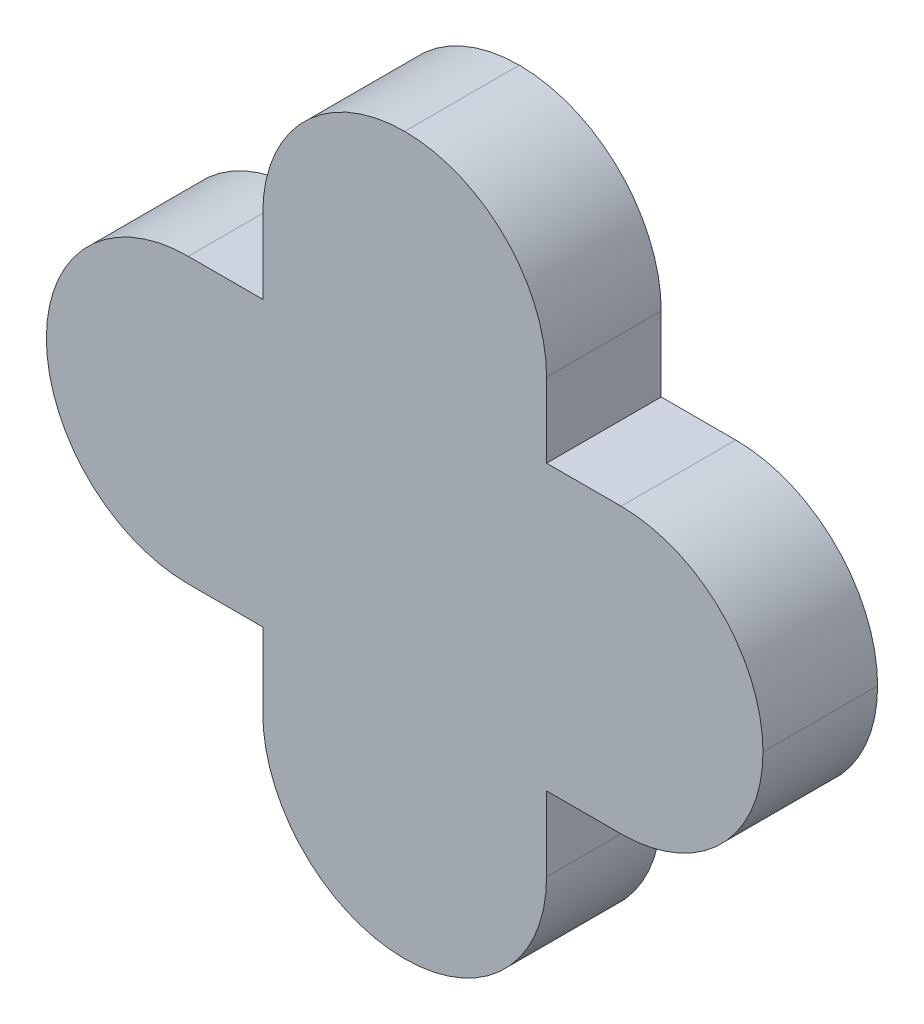
ISO-10303-21;
HEADER;
FILE_DESCRIPTION(('STEP AP214'),'2;1');
FILE_NAME('part.step','',(''),(''),'','','');
FILE_SCHEMA(('AUTOMOTIVE_DESIGN { 1 0 10303 214 1 1 1 1 }'));
ENDSEC;
DATA;
#1=APPLICATION_CONTEXT('core data for automotive mechanical design processes');
#2=APPLICATION_PROTOCOL_DEFINITION('international standard','automotive_design',2000,#1);
#3=PRODUCT_CONTEXT('',#1,'mechanical');
#4=PRODUCT('Part','Part','',(#3));
#5=PRODUCT_RELATED_PRODUCT_CATEGORY('part','',(#4));
#6=PRODUCT_DEFINITION_FORMATION('','',#4);
#7=PRODUCT_DEFINITION_CONTEXT('part definition',#1,'design');
#8=PRODUCT_DEFINITION('design','',#6,#7);
#9=PRODUCT_DEFINITION_SHAPE('','',#8);
#10=(LENGTH_UNIT() NAMED_UNIT(*) SI_UNIT(.MILLI.,.METRE.));
#11=(NAMED_UNIT(*) PLANE_ANGLE_UNIT() SI_UNIT($,.RADIAN.));
#12=(NAMED_UNIT(*) SI_UNIT($,.STERADIAN.) SOLID_ANGLE_UNIT());
#13=UNCERTAINTY_MEASURE_WITH_UNIT(LENGTH_MEASURE(1.E-05),#10,'distance_accuracy_value','');
#14=(GEOMETRIC_REPRESENTATION_CONTEXT(3) GLOBAL_UNCERTAINTY_ASSIGNED_CONTEXT((#13)) GLOBAL_UNIT_ASSIGNED_CONTEXT((#10,
#11,#12)) REPRESENTATION_CONTEXT('',''));
#15=CARTESIAN_POINT('',(0.,0.,0.));
#16=DIRECTION('',(0.,0.,1.));
#17=DIRECTION('',(1.,0.,0.));
#18=AXIS2_PLACEMENT_3D('',#15,#16,#17);
#19=CARTESIAN_POINT('',(2.475,0.,2.));
#20=DIRECTION('',(-1.,0.,0.));
#21=DIRECTION('',(0.,-1.,0.));
#22=AXIS2_PLACEMENT_3D('',#19,#20,#21);
#23=PLANE('',#22);
#24=DIRECTION('',(0.,1.,0.));
#25=VECTOR('',#24,1.);
#26=CARTESIAN_POINT('',(2.475,0.,2.));
#27=LINE('',#26,#25);
#28=CARTESIAN_POINT('',(2.475,-3.775,2.));
#29=VERTEX_POINT('',#28);
#30=CARTESIAN_POINT('',(2.475,-2.475,2.));
#31=VERTEX_POINT('',#30);
#32=EDGE_CURVE('E163',#29,#31,#27,.T.);
#33=ORIENTED_EDGE('',*,*,#32,.F.);
#34=DIRECTION('',(0.,0.,-1.));
#35=VECTOR('',#34,1.);
#36=CARTESIAN_POINT('',(2.475,-3.775,2.));
#37=LINE('',#36,#35);
#38=CARTESIAN_POINT('',(2.475,-3.775,0.));
#39=VERTEX_POINT('',#38);
#40=EDGE_CURVE('E302',#29,#39,#37,.T.);
#41=ORIENTED_EDGE('',*,*,#40,.T.);
#42=DIRECTION('',(0.,1.,0.));
#43=VECTOR('',#42,1.);
#44=CARTESIAN_POINT('',(2.475,0.,0.));
#45=LINE('',#44,#43);
#46=CARTESIAN_POINT('',(2.475,-2.475,0.));
#47=VERTEX_POINT('',#46);
#48=EDGE_CURVE('E180',#39,#47,#45,.T.);
#49=ORIENTED_EDGE('',*,*,#48,.T.);
#50=DIRECTION('',(0.,0.,-1.));
#51=VECTOR('',#50,1.);
#52=CARTESIAN_POINT('',(2.475,-2.475,2.));
#53=LINE('',#52,#51);
#54=EDGE_CURVE('E178',#31,#47,#53,.T.);
#55=ORIENTED_EDGE('',*,*,#54,.F.);
#56=EDGE_LOOP('',(#33,#41,#49,#55));
#57=FACE_BOUND('',#56,.T.);
#58=ADVANCED_FACE('F47',(#57),#23,.F.);
#59=CARTESIAN_POINT('',(0.,-2.475,2.));
#60=DIRECTION('',(0.,1.,0.));
#61=DIRECTION('',(-1.,0.,0.));
#62=AXIS2_PLACEMENT_3D('',#59,#60,#61);
#63=PLANE('',#62);
#64=DIRECTION('',(1.,0.,0.));
#65=VECTOR('',#64,1.);
#66=CARTESIAN_POINT('',(0.,-2.475,0.));
#67=LINE('',#66,#65);
#68=CARTESIAN_POINT('',(3.775,-2.475,0.));
#69=VERTEX_POINT('',#68);
#70=EDGE_CURVE('E217',#47,#69,#67,.T.);
#71=ORIENTED_EDGE('',*,*,#70,.T.);
#72=DIRECTION('',(0.,0.,-1.));
#73=VECTOR('',#72,1.);
#74=CARTESIAN_POINT('',(3.775,-2.475,2.));
#75=LINE('',#74,#73);
#76=CARTESIAN_POINT('',(3.775,-2.475,2.));
#77=VERTEX_POINT('',#76);
#78=EDGE_CURVE('E190',#69,#77,#75,.F.);
#79=ORIENTED_EDGE('',*,*,#78,.T.);
#80=DIRECTION('',(1.,0.,0.));
#81=VECTOR('',#80,1.);
#82=CARTESIAN_POINT('',(0.,-2.475,2.));
#83=LINE('',#82,#81);
#84=EDGE_CURVE('E167',#31,#77,#83,.T.);
#85=ORIENTED_EDGE('',*,*,#84,.F.);
#86=ORIENTED_EDGE('',*,*,#54,.T.);
#87=EDGE_LOOP('',(#71,#79,#85,#86));
#88=FACE_BOUND('',#87,.T.);
#89=ADVANCED_FACE('F188',(#88),#63,.F.);
#90=CARTESIAN_POINT('',(0.,2.475,2.));
#91=DIRECTION('',(0.,1.,0.));
#92=DIRECTION('',(-1.,0.,0.));
#93=AXIS2_PLACEMENT_3D('',#90,#91,#92);
#94=PLANE('',#93);
#95=DIRECTION('',(1.,0.,0.));
#96=VECTOR('',#95,1.);
#97=CARTESIAN_POINT('',(0.,2.475,2.));
#98=LINE('',#97,#96);
#99=CARTESIAN_POINT('',(2.475,2.475,2.));
#100=VERTEX_POINT('',#99);
#101=CARTESIAN_POINT('',(3.775,2.475,2.));
#102=VERTEX_POINT('',#101);
#103=EDGE_CURVE('E192',#100,#102,#98,.T.);
#104=ORIENTED_EDGE('',*,*,#103,.T.);
#105=DIRECTION('',(0.,0.,-1.));
#106=VECTOR('',#105,1.);
#107=CARTESIAN_POINT('',(3.775,2.475,0.));
#108=LINE('',#107,#106);
#109=CARTESIAN_POINT('',(3.775,2.475,0.));
#110=VERTEX_POINT('',#109);
#111=EDGE_CURVE('E185',#102,#110,#108,.T.);
#112=ORIENTED_EDGE('',*,*,#111,.T.);
#113=DIRECTION('',(1.,0.,0.));
#114=VECTOR('',#113,1.);
#115=CARTESIAN_POINT('',(0.,2.475,0.));
#116=LINE('',#115,#114);
#117=CARTESIAN_POINT('',(2.475,2.475,0.));
#118=VERTEX_POINT('',#117);
#119=EDGE_CURVE('E221',#118,#110,#116,.T.);
#120=ORIENTED_EDGE('',*,*,#119,.F.);
#121=DIRECTION('',(0.,0.,-1.));
#122=VECTOR('',#121,1.);
#123=CARTESIAN_POINT('',(2.475,2.475,2.));
#124=LINE('',#123,#122);
#125=EDGE_CURVE('E186',#100,#118,#124,.T.);
#126=ORIENTED_EDGE('',*,*,#125,.F.);
#127=EDGE_LOOP('',(#104,#112,#120,#126));
#128=FACE_BOUND('',#127,.T.);
#129=ADVANCED_FACE('F350',(#128),#94,.T.);
#130=CARTESIAN_POINT('',(2.475,0.,2.));
#131=DIRECTION('',(1.,0.,0.));
#132=DIRECTION('',(0.,1.,0.));
#133=AXIS2_PLACEMENT_3D('',#130,#131,#132);
#134=PLANE('',#133);
#135=DIRECTION('',(0.,-1.,0.));
#136=VECTOR('',#135,1.);
#137=CARTESIAN_POINT('',(2.475,0.,0.));
#138=LINE('',#137,#136);
#139=CARTESIAN_POINT('',(2.475,3.775,0.));
#140=VERTEX_POINT('',#139);
#141=EDGE_CURVE('E225',#140,#118,#138,.T.);
#142=ORIENTED_EDGE('',*,*,#141,.F.);
#143=DIRECTION('',(0.,0.,-1.));
#144=VECTOR('',#143,1.);
#145=CARTESIAN_POINT('',(2.475,3.775,2.));
#146=LINE('',#145,#144);
#147=CARTESIAN_POINT('',(2.475,3.775,2.));
#148=VERTEX_POINT('',#147);
#149=EDGE_CURVE('E11',#140,#148,#146,.F.);
#150=ORIENTED_EDGE('',*,*,#149,.T.);
#151=DIRECTION('',(0.,-1.,0.));
#152=VECTOR('',#151,1.);
#153=CARTESIAN_POINT('',(2.475,0.,2.));
#154=LINE('',#153,#152);
#155=EDGE_CURVE('E196',#148,#100,#154,.T.);
#156=ORIENTED_EDGE('',*,*,#155,.T.);
#157=ORIENTED_EDGE('',*,*,#125,.T.);
#158=EDGE_LOOP('',(#142,#150,#156,#157));
#159=FACE_BOUND('',#158,.T.);
#160=ADVANCED_FACE('F344',(#159),#134,.T.);
#161=CARTESIAN_POINT('',(-2.475,0.,2.));
#162=DIRECTION('',(1.,0.,0.));
#163=DIRECTION('',(0.,1.,0.));
#164=AXIS2_PLACEMENT_3D('',#161,#162,#163);
#165=PLANE('',#164);
#166=DIRECTION('',(0.,-1.,0.));
#167=VECTOR('',#166,1.);
#168=CARTESIAN_POINT('',(-2.475,0.,2.));
#169=LINE('',#168,#167);
#170=CARTESIAN_POINT('',(-2.475,3.775,2.));
#171=VERTEX_POINT('',#170);
#172=CARTESIAN_POINT('',(-2.475,2.475,2.));
#173=VERTEX_POINT('',#172);
#174=EDGE_CURVE('E201',#171,#173,#169,.T.);
#175=ORIENTED_EDGE('',*,*,#174,.F.);
#176=DIRECTION('',(0.,0.,-1.));
#177=VECTOR('',#176,1.);
#178=CARTESIAN_POINT('',(-2.475,3.775,0.));
#179=LINE('',#178,#177);
#180=CARTESIAN_POINT('',(-2.475,3.775,0.));
#181=VERTEX_POINT('',#180);
#182=EDGE_CURVE('E57',#171,#181,#179,.T.);
#183=ORIENTED_EDGE('',*,*,#182,.T.);
#184=DIRECTION('',(0.,-1.,0.));
#185=VECTOR('',#184,1.);
#186=CARTESIAN_POINT('',(-2.475,0.,0.));
#187=LINE('',#186,#185);
#188=CARTESIAN_POINT('',(-2.475,2.475,0.));
#189=VERTEX_POINT('',#188);
#190=EDGE_CURVE('E228',#181,#189,#187,.T.);
#191=ORIENTED_EDGE('',*,*,#190,.T.);
#192=DIRECTION('',(0.,0.,-1.));
#193=VECTOR('',#192,1.);
#194=CARTESIAN_POINT('',(-2.475,2.475,2.));
#195=LINE('',#194,#193);
#196=EDGE_CURVE('E244',#173,#189,#195,.T.);
#197=ORIENTED_EDGE('',*,*,#196,.F.);
#198=EDGE_LOOP('',(#175,#183,#191,#197));
#199=FACE_BOUND('',#198,.T.);
#200=ADVANCED_FACE('F362',(#199),#165,.F.);
#201=CARTESIAN_POINT('',(0.,2.475,2.));
#202=DIRECTION('',(0.,-1.,0.));
#203=DIRECTION('',(1.,0.,0.));
#204=AXIS2_PLACEMENT_3D('',#201,#202,#203);
#205=PLANE('',#204);
#206=DIRECTION('',(-1.,0.,0.));
#207=VECTOR('',#206,1.);
#208=CARTESIAN_POINT('',(0.,2.475,0.));
#209=LINE('',#208,#207);
#210=CARTESIAN_POINT('',(-3.775,2.475,0.));
#211=VERTEX_POINT('',#210);
#212=EDGE_CURVE('E231',#189,#211,#209,.T.);
#213=ORIENTED_EDGE('',*,*,#212,.T.);
#214=DIRECTION('',(0.,0.,-1.));
#215=VECTOR('',#214,1.);
#216=CARTESIAN_POINT('',(-3.775,2.475,2.));
#217=LINE('',#216,#215);
#218=CARTESIAN_POINT('',(-3.775,2.475,2.));
#219=VERTEX_POINT('',#218);
#220=EDGE_CURVE('E311',#211,#219,#217,.F.);
#221=ORIENTED_EDGE('',*,*,#220,.T.);
#222=DIRECTION('',(-1.,0.,0.));
#223=VECTOR('',#222,1.);
#224=CARTESIAN_POINT('',(0.,2.475,2.));
#225=LINE('',#224,#223);
#226=EDGE_CURVE('E204',#173,#219,#225,.T.);
#227=ORIENTED_EDGE('',*,*,#226,.F.);
#228=ORIENTED_EDGE('',*,*,#196,.T.);
#229=EDGE_LOOP('',(#213,#221,#227,#228));
#230=FACE_BOUND('',#229,.T.);
#231=ADVANCED_FACE('F366',(#230),#205,.F.);
#232=CARTESIAN_POINT('',(0.,-2.475,2.));
#233=DIRECTION('',(0.,-1.,0.));
#234=DIRECTION('',(1.,0.,0.));
#235=AXIS2_PLACEMENT_3D('',#232,#233,#234);
#236=PLANE('',#235);
#237=DIRECTION('',(-1.,0.,0.));
#238=VECTOR('',#237,1.);
#239=CARTESIAN_POINT('',(0.,-2.475,2.));
#240=LINE('',#239,#238);
#241=CARTESIAN_POINT('',(-2.475,-2.475,2.));
#242=VERTEX_POINT('',#241);
#243=CARTESIAN_POINT('',(-3.775,-2.475,2.));
#244=VERTEX_POINT('',#243);
#245=EDGE_CURVE('E208',#242,#244,#240,.T.);
#246=ORIENTED_EDGE('',*,*,#245,.T.);
#247=DIRECTION('',(0.,0.,-1.));
#248=VECTOR('',#247,1.);
#249=CARTESIAN_POINT('',(-3.775,-2.475,2.));
#250=LINE('',#249,#248);
#251=CARTESIAN_POINT('',(-3.775,-2.475,0.));
#252=VERTEX_POINT('',#251);
#253=EDGE_CURVE('E307',#244,#252,#250,.T.);
#254=ORIENTED_EDGE('',*,*,#253,.T.);
#255=DIRECTION('',(-1.,0.,0.));
#256=VECTOR('',#255,1.);
#257=CARTESIAN_POINT('',(0.,-2.475,0.));
#258=LINE('',#257,#256);
#259=CARTESIAN_POINT('',(-2.475,-2.475,0.));
#260=VERTEX_POINT('',#259);
#261=EDGE_CURVE('E235',#260,#252,#258,.T.);
#262=ORIENTED_EDGE('',*,*,#261,.F.);
#263=DIRECTION('',(0.,0.,-1.));
#264=VECTOR('',#263,1.);
#265=CARTESIAN_POINT('',(-2.475,-2.475,2.));
#266=LINE('',#265,#264);
#267=EDGE_CURVE('E214',#242,#260,#266,.T.);
#268=ORIENTED_EDGE('',*,*,#267,.F.);
#269=EDGE_LOOP('',(#246,#254,#262,#268));
#270=FACE_BOUND('',#269,.T.);
#271=ADVANCED_FACE('F376',(#270),#236,.T.);
#272=CARTESIAN_POINT('',(-2.475,0.,2.));
#273=DIRECTION('',(-1.,0.,0.));
#274=DIRECTION('',(0.,-1.,0.));
#275=AXIS2_PLACEMENT_3D('',#272,#273,#274);
#276=PLANE('',#275);
#277=DIRECTION('',(0.,1.,0.));
#278=VECTOR('',#277,1.);
#279=CARTESIAN_POINT('',(-2.475,0.,0.));
#280=LINE('',#279,#278);
#281=CARTESIAN_POINT('',(-2.475,-3.775,0.));
#282=VERTEX_POINT('',#281);
#283=EDGE_CURVE('E175',#282,#260,#280,.T.);
#284=ORIENTED_EDGE('',*,*,#283,.F.);
#285=DIRECTION('',(0.,0.,-1.));
#286=VECTOR('',#285,1.);
#287=CARTESIAN_POINT('',(-2.475,-3.775,2.));
#288=LINE('',#287,#286);
#289=CARTESIAN_POINT('',(-2.475,-3.775,2.));
#290=VERTEX_POINT('',#289);
#291=EDGE_CURVE('E65',#282,#290,#288,.F.);
#292=ORIENTED_EDGE('',*,*,#291,.T.);
#293=DIRECTION('',(0.,1.,0.));
#294=VECTOR('',#293,1.);
#295=CARTESIAN_POINT('',(-2.475,0.,2.));
#296=LINE('',#295,#294);
#297=EDGE_CURVE('E211',#290,#242,#296,.T.);
#298=ORIENTED_EDGE('',*,*,#297,.T.);
#299=ORIENTED_EDGE('',*,*,#267,.T.);
#300=EDGE_LOOP('',(#284,#292,#298,#299));
#301=FACE_BOUND('',#300,.T.);
#302=ADVANCED_FACE('F379',(#301),#276,.T.);
#303=CARTESIAN_POINT('',(0.,0.,2.));
#304=DIRECTION('',(0.,0.,1.));
#305=DIRECTION('',(1.,0.,0.));
#306=AXIS2_PLACEMENT_3D('',#303,#304,#305);
#307=PLANE('',#306);
#308=CARTESIAN_POINT('',(3.775,0.,2.));
#309=DIRECTION('',(0.,0.,1.));
#310=DIRECTION('',(1.,0.,0.));
#311=AXIS2_PLACEMENT_3D('',#308,#309,#310);
#312=CIRCLE('',#311,2.475);
#313=CARTESIAN_POINT('',(6.25,0.,2.));
#314=VERTEX_POINT('',#313);
#315=EDGE_CURVE('E294',#77,#314,#312,.T.);
#316=ORIENTED_EDGE('',*,*,#315,.T.);
#317=CARTESIAN_POINT('',(3.775,0.,2.));
#318=DIRECTION('',(0.,0.,1.));
#319=DIRECTION('',(1.,0.,0.));
#320=AXIS2_PLACEMENT_3D('',#317,#318,#319);
#321=CIRCLE('',#320,2.475);
#322=EDGE_CURVE('E297',#314,#102,#321,.T.);
#323=ORIENTED_EDGE('',*,*,#322,.T.);
#324=ORIENTED_EDGE('',*,*,#103,.F.);
#325=ORIENTED_EDGE('',*,*,#155,.F.);
#326=CARTESIAN_POINT('',(0.,3.775,2.));
#327=DIRECTION('',(0.,0.,1.));
#328=DIRECTION('',(1.,0.,0.));
#329=AXIS2_PLACEMENT_3D('',#326,#327,#328);
#330=CIRCLE('',#329,2.475);
#331=CARTESIAN_POINT('',(0.,6.25,2.));
#332=VERTEX_POINT('',#331);
#333=EDGE_CURVE('E278',#148,#332,#330,.T.);
#334=ORIENTED_EDGE('',*,*,#333,.T.);
#335=CARTESIAN_POINT('',(0.,3.775,2.));
#336=DIRECTION('',(0.,0.,1.));
#337=DIRECTION('',(1.,0.,0.));
#338=AXIS2_PLACEMENT_3D('',#335,#336,#337);
#339=CIRCLE('',#338,2.475);
#340=EDGE_CURVE('E281',#332,#171,#339,.T.);
#341=ORIENTED_EDGE('',*,*,#340,.T.);
#342=ORIENTED_EDGE('',*,*,#174,.T.);
#343=ORIENTED_EDGE('',*,*,#226,.T.);
#344=CARTESIAN_POINT('',(-3.775,0.,2.));
#345=DIRECTION('',(0.,0.,1.));
#346=DIRECTION('',(1.,0.,0.));
#347=AXIS2_PLACEMENT_3D('',#344,#345,#346);
#348=CIRCLE('',#347,2.475);
#349=CARTESIAN_POINT('',(-6.25,0.,2.));
#350=VERTEX_POINT('',#349);
#351=EDGE_CURVE('E284',#219,#350,#348,.T.);
#352=ORIENTED_EDGE('',*,*,#351,.T.);
#353=CARTESIAN_POINT('',(-3.775,0.,2.));
#354=DIRECTION('',(0.,0.,1.));
#355=DIRECTION('',(1.,0.,0.));
#356=AXIS2_PLACEMENT_3D('',#353,#354,#355);
#357=CIRCLE('',#356,2.475);
#358=EDGE_CURVE('E73',#350,#244,#357,.T.);
#359=ORIENTED_EDGE('',*,*,#358,.T.);
#360=ORIENTED_EDGE('',*,*,#245,.F.);
#361=ORIENTED_EDGE('',*,*,#297,.F.);
#362=CARTESIAN_POINT('',(0.,-3.775,2.));
#363=DIRECTION('',(0.,0.,1.));
#364=DIRECTION('',(1.,0.,0.));
#365=AXIS2_PLACEMENT_3D('',#362,#363,#364);
#366=CIRCLE('',#365,2.475);
#367=CARTESIAN_POINT('',(0.,-6.25,2.));
#368=VERTEX_POINT('',#367);
#369=EDGE_CURVE('E289',#290,#368,#366,.T.);
#370=ORIENTED_EDGE('',*,*,#369,.T.);
#371=CARTESIAN_POINT('',(0.,-3.775,2.));
#372=DIRECTION('',(0.,0.,1.));
#373=DIRECTION('',(1.,0.,0.));
#374=AXIS2_PLACEMENT_3D('',#371,#372,#373);
#375=CIRCLE('',#374,2.475);
#376=EDGE_CURVE('E170',#368,#29,#375,.T.);
#377=ORIENTED_EDGE('',*,*,#376,.T.);
#378=ORIENTED_EDGE('',*,*,#32,.T.);
#379=ORIENTED_EDGE('',*,*,#84,.T.);
#380=EDGE_LOOP('',(#316,#323,#324,#325,#334,#341,#342,#343,#352,#359,#360,#361,#370,#377,#378,#379));
#381=FACE_BOUND('',#380,.T.);
#382=ADVANCED_FACE('F165',(#381),#307,.T.);
#383=CARTESIAN_POINT('',(0.,0.,0.));
#384=DIRECTION('',(0.,0.,1.));
#385=DIRECTION('',(1.,0.,0.));
#386=AXIS2_PLACEMENT_3D('',#383,#384,#385);
#387=PLANE('',#386);
#388=ORIENTED_EDGE('',*,*,#119,.T.);
#389=CARTESIAN_POINT('',(3.775,0.,0.));
#390=DIRECTION('',(0.,0.,1.));
#391=DIRECTION('',(1.,0.,0.));
#392=AXIS2_PLACEMENT_3D('',#389,#390,#391);
#393=CIRCLE('',#392,2.475);
#394=CARTESIAN_POINT('',(6.25,0.,0.));
#395=VERTEX_POINT('',#394);
#396=EDGE_CURVE('E275',#110,#395,#393,.F.);
#397=ORIENTED_EDGE('',*,*,#396,.T.);
#398=CARTESIAN_POINT('',(3.775,0.,0.));
#399=DIRECTION('',(0.,0.,1.));
#400=DIRECTION('',(1.,0.,0.));
#401=AXIS2_PLACEMENT_3D('',#398,#399,#400);
#402=CIRCLE('',#401,2.475);
#403=EDGE_CURVE('E272',#395,#69,#402,.F.);
#404=ORIENTED_EDGE('',*,*,#403,.T.);
#405=ORIENTED_EDGE('',*,*,#70,.F.);
#406=ORIENTED_EDGE('',*,*,#48,.F.);
#407=CARTESIAN_POINT('',(0.,-3.775,0.));
#408=DIRECTION('',(0.,0.,1.));
#409=DIRECTION('',(1.,0.,0.));
#410=AXIS2_PLACEMENT_3D('',#407,#408,#409);
#411=CIRCLE('',#410,2.475);
#412=CARTESIAN_POINT('',(0.,-6.25,0.));
#413=VERTEX_POINT('',#412);
#414=EDGE_CURVE('E269',#39,#413,#411,.F.);
#415=ORIENTED_EDGE('',*,*,#414,.T.);
#416=CARTESIAN_POINT('',(0.,-3.775,0.));
#417=DIRECTION('',(0.,0.,1.));
#418=DIRECTION('',(1.,0.,0.));
#419=AXIS2_PLACEMENT_3D('',#416,#417,#418);
#420=CIRCLE('',#419,2.475);
#421=EDGE_CURVE('E266',#413,#282,#420,.F.);
#422=ORIENTED_EDGE('',*,*,#421,.T.);
#423=ORIENTED_EDGE('',*,*,#283,.T.);
#424=ORIENTED_EDGE('',*,*,#261,.T.);
#425=CARTESIAN_POINT('',(-3.775,0.,0.));
#426=DIRECTION('',(0.,0.,1.));
#427=DIRECTION('',(1.,0.,0.));
#428=AXIS2_PLACEMENT_3D('',#425,#426,#427);
#429=CIRCLE('',#428,2.475);
#430=CARTESIAN_POINT('',(-6.25,0.,0.));
#431=VERTEX_POINT('',#430);
#432=EDGE_CURVE('E263',#252,#431,#429,.F.);
#433=ORIENTED_EDGE('',*,*,#432,.T.);
#434=CARTESIAN_POINT('',(-3.775,0.,0.));
#435=DIRECTION('',(0.,0.,1.));
#436=DIRECTION('',(1.,0.,0.));
#437=AXIS2_PLACEMENT_3D('',#434,#435,#436);
#438=CIRCLE('',#437,2.475);
#439=EDGE_CURVE('E260',#431,#211,#438,.F.);
#440=ORIENTED_EDGE('',*,*,#439,.T.);
#441=ORIENTED_EDGE('',*,*,#212,.F.);
#442=ORIENTED_EDGE('',*,*,#190,.F.);
#443=CARTESIAN_POINT('',(0.,3.775,0.));
#444=DIRECTION('',(0.,0.,1.));
#445=DIRECTION('',(1.,0.,0.));
#446=AXIS2_PLACEMENT_3D('',#443,#444,#445);
#447=CIRCLE('',#446,2.475);
#448=CARTESIAN_POINT('',(0.,6.25,0.));
#449=VERTEX_POINT('',#448);
#450=EDGE_CURVE('E257',#181,#449,#447,.F.);
#451=ORIENTED_EDGE('',*,*,#450,.T.);
#452=CARTESIAN_POINT('',(0.,3.775,0.));
#453=DIRECTION('',(0.,0.,1.));
#454=DIRECTION('',(1.,0.,0.));
#455=AXIS2_PLACEMENT_3D('',#452,#453,#454);
#456=CIRCLE('',#455,2.475);
#457=EDGE_CURVE('E254',#449,#140,#456,.F.);
#458=ORIENTED_EDGE('',*,*,#457,.T.);
#459=ORIENTED_EDGE('',*,*,#141,.T.);
#460=EDGE_LOOP('',(#388,#397,#404,#405,#406,#415,#422,#423,#424,#433,#440,#441,#442,#451,#458,#459));
#461=FACE_BOUND('',#460,.T.);
#462=ADVANCED_FACE('F341',(#461),#387,.F.);
#463=CARTESIAN_POINT('',(3.775,0.,2.));
#464=DIRECTION('',(0.,0.,-1.));
#465=DIRECTION('',(-1.,0.,0.));
#466=AXIS2_PLACEMENT_3D('',#463,#464,#465);
#467=CYLINDRICAL_SURFACE('',#466,2.475);
#468=DIRECTION('',(0.,0.,-1.));
#469=VECTOR('',#468,1.);
#470=CARTESIAN_POINT('',(6.25,0.,2.));
#471=LINE('',#470,#469);
#472=EDGE_CURVE('E218',#314,#395,#471,.T.);
#473=ORIENTED_EDGE('',*,*,#472,.F.);
#474=ORIENTED_EDGE('',*,*,#315,.F.);
#475=ORIENTED_EDGE('',*,*,#78,.F.);
#476=ORIENTED_EDGE('',*,*,#403,.F.);
#477=EDGE_LOOP('',(#473,#474,#475,#476));
#478=FACE_BOUND('',#477,.T.);
#479=ADVANCED_FACE('F356',(#478),#467,.T.);
#480=CARTESIAN_POINT('',(3.775,0.,2.));
#481=DIRECTION('',(0.,0.,1.));
#482=DIRECTION('',(1.,0.,0.));
#483=AXIS2_PLACEMENT_3D('',#480,#481,#482);
#484=CYLINDRICAL_SURFACE('',#483,2.475);
#485=ORIENTED_EDGE('',*,*,#322,.F.);
#486=ORIENTED_EDGE('',*,*,#472,.T.);
#487=ORIENTED_EDGE('',*,*,#396,.F.);
#488=ORIENTED_EDGE('',*,*,#111,.F.);
#489=EDGE_LOOP('',(#485,#486,#487,#488));
#490=FACE_BOUND('',#489,.T.);
#491=ADVANCED_FACE('F358',(#490),#484,.T.);
#492=CARTESIAN_POINT('',(0.,-3.775,2.));
#493=DIRECTION('',(0.,0.,1.));
#494=DIRECTION('',(1.,0.,0.));
#495=AXIS2_PLACEMENT_3D('',#492,#493,#494);
#496=CYLINDRICAL_SURFACE('',#495,2.475);
#497=DIRECTION('',(0.,0.,-1.));
#498=VECTOR('',#497,1.);
#499=CARTESIAN_POINT('',(0.,-6.25,0.));
#500=LINE('',#499,#498);
#501=EDGE_CURVE('E320',#368,#413,#500,.T.);
#502=ORIENTED_EDGE('',*,*,#501,.F.);
#503=ORIENTED_EDGE('',*,*,#369,.F.);
#504=ORIENTED_EDGE('',*,*,#291,.F.);
#505=ORIENTED_EDGE('',*,*,#421,.F.);
#506=EDGE_LOOP('',(#502,#503,#504,#505));
#507=FACE_BOUND('',#506,.T.);
#508=ADVANCED_FACE('F383',(#507),#496,.T.);
#509=CARTESIAN_POINT('',(0.,-3.775,2.));
#510=DIRECTION('',(0.,0.,-1.));
#511=DIRECTION('',(-1.,0.,0.));
#512=AXIS2_PLACEMENT_3D('',#509,#510,#511);
#513=CYLINDRICAL_SURFACE('',#512,2.475);
#514=ORIENTED_EDGE('',*,*,#376,.F.);
#515=ORIENTED_EDGE('',*,*,#501,.T.);
#516=ORIENTED_EDGE('',*,*,#414,.F.);
#517=ORIENTED_EDGE('',*,*,#40,.F.);
#518=EDGE_LOOP('',(#514,#515,#516,#517));
#519=FACE_BOUND('',#518,.T.);
#520=ADVANCED_FACE('F385',(#519),#513,.T.);
#521=CARTESIAN_POINT('',(-3.775,0.,2.));
#522=DIRECTION('',(0.,0.,1.));
#523=DIRECTION('',(1.,0.,0.));
#524=AXIS2_PLACEMENT_3D('',#521,#522,#523);
#525=CYLINDRICAL_SURFACE('',#524,2.475);
#526=DIRECTION('',(0.,0.,-1.));
#527=VECTOR('',#526,1.);
#528=CARTESIAN_POINT('',(-6.25,0.,0.));
#529=LINE('',#528,#527);
#530=EDGE_CURVE('E323',#350,#431,#529,.T.);
#531=ORIENTED_EDGE('',*,*,#530,.F.);
#532=ORIENTED_EDGE('',*,*,#351,.F.);
#533=ORIENTED_EDGE('',*,*,#220,.F.);
#534=ORIENTED_EDGE('',*,*,#439,.F.);
#535=EDGE_LOOP('',(#531,#532,#533,#534));
#536=FACE_BOUND('',#535,.T.);
#537=ADVANCED_FACE('F370',(#536),#525,.T.);
#538=CARTESIAN_POINT('',(-3.775,0.,2.));
#539=DIRECTION('',(0.,0.,-1.));
#540=DIRECTION('',(-1.,0.,0.));
#541=AXIS2_PLACEMENT_3D('',#538,#539,#540);
#542=CYLINDRICAL_SURFACE('',#541,2.475);
#543=ORIENTED_EDGE('',*,*,#358,.F.);
#544=ORIENTED_EDGE('',*,*,#530,.T.);
#545=ORIENTED_EDGE('',*,*,#432,.F.);
#546=ORIENTED_EDGE('',*,*,#253,.F.);
#547=EDGE_LOOP('',(#543,#544,#545,#546));
#548=FACE_BOUND('',#547,.T.);
#549=ADVANCED_FACE('F373',(#548),#542,.T.);
#550=CARTESIAN_POINT('',(0.,3.775,2.));
#551=DIRECTION('',(0.,0.,-1.));
#552=DIRECTION('',(-1.,0.,0.));
#553=AXIS2_PLACEMENT_3D('',#550,#551,#552);
#554=CYLINDRICAL_SURFACE('',#553,2.475);
#555=DIRECTION('',(0.,0.,-1.));
#556=VECTOR('',#555,1.);
#557=CARTESIAN_POINT('',(0.,6.25,2.));
#558=LINE('',#557,#556);
#559=EDGE_CURVE('E51',#332,#449,#558,.T.);
#560=ORIENTED_EDGE('',*,*,#559,.F.);
#561=ORIENTED_EDGE('',*,*,#333,.F.);
#562=ORIENTED_EDGE('',*,*,#149,.F.);
#563=ORIENTED_EDGE('',*,*,#457,.F.);
#564=EDGE_LOOP('',(#560,#561,#562,#563));
#565=FACE_BOUND('',#564,.T.);
#566=ADVANCED_FACE('F49',(#565),#554,.T.);
#567=CARTESIAN_POINT('',(0.,3.775,2.));
#568=DIRECTION('',(0.,0.,1.));
#569=DIRECTION('',(1.,0.,0.));
#570=AXIS2_PLACEMENT_3D('',#567,#568,#569);
#571=CYLINDRICAL_SURFACE('',#570,2.475);
#572=ORIENTED_EDGE('',*,*,#340,.F.);
#573=ORIENTED_EDGE('',*,*,#559,.T.);
#574=ORIENTED_EDGE('',*,*,#450,.F.);
#575=ORIENTED_EDGE('',*,*,#182,.F.);
#576=EDGE_LOOP('',(#572,#573,#574,#575));
#577=FACE_BOUND('',#576,.T.);
#578=ADVANCED_FACE('F333',(#577),#571,.T.);
#579=CLOSED_SHELL('',(#58,#89,#129,#160,#200,#231,#271,#302,#382,#462,#479,#491,#508,#520,#537,
#549,#566,#578));
#580=MANIFOLD_SOLID_BREP('B2',#579);
#581=ADVANCED_BREP_SHAPE_REPRESENTATION('',(#18,#580),#14);
#582=SHAPE_DEFINITION_REPRESENTATION(#9,#581);
ENDSEC;
END-ISO-10303-21;
